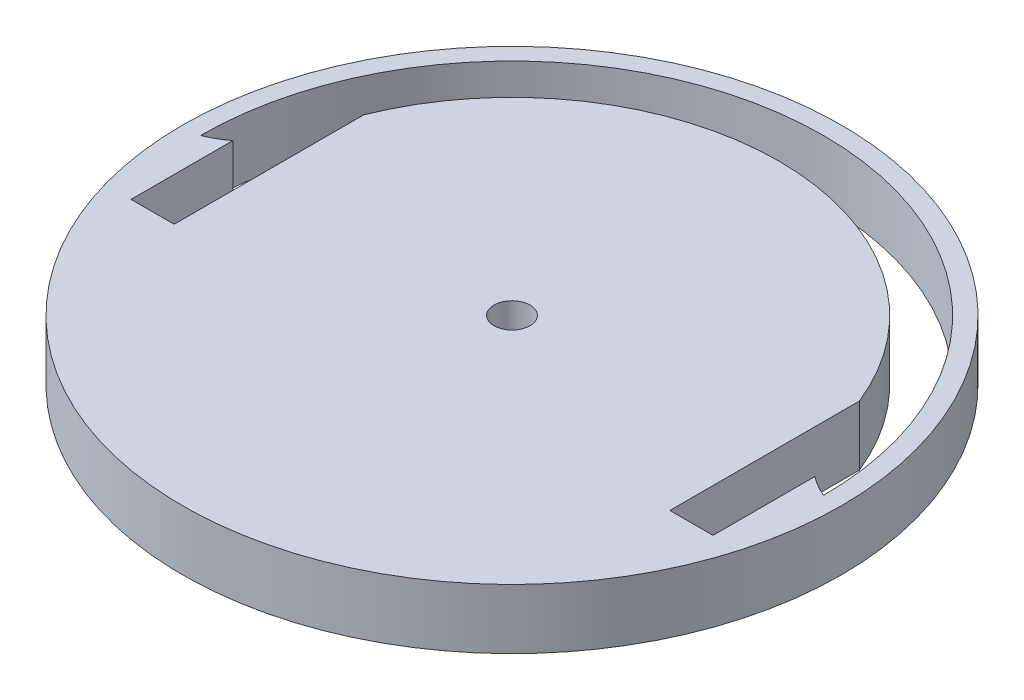
ISO-10303-21;
HEADER;
FILE_DESCRIPTION(('STEP AP214'),'2;1');
FILE_NAME('part.step','',(''),(''),'','','');
FILE_SCHEMA(('AUTOMOTIVE_DESIGN { 1 0 10303 214 1 1 1 1 }'));
ENDSEC;
DATA;
#1=APPLICATION_CONTEXT('core data for automotive mechanical design processes');
#2=APPLICATION_PROTOCOL_DEFINITION('international standard','automotive_design',2000,#1);
#3=PRODUCT_CONTEXT('',#1,'mechanical');
#4=PRODUCT('Part','Part','',(#3));
#5=PRODUCT_RELATED_PRODUCT_CATEGORY('part','',(#4));
#6=PRODUCT_DEFINITION_FORMATION('','',#4);
#7=PRODUCT_DEFINITION_CONTEXT('part definition',#1,'design');
#8=PRODUCT_DEFINITION('design','',#6,#7);
#9=PRODUCT_DEFINITION_SHAPE('','',#8);
#10=(LENGTH_UNIT() NAMED_UNIT(*) SI_UNIT(.MILLI.,.METRE.));
#11=(NAMED_UNIT(*) PLANE_ANGLE_UNIT() SI_UNIT($,.RADIAN.));
#12=(NAMED_UNIT(*) SI_UNIT($,.STERADIAN.) SOLID_ANGLE_UNIT());
#13=UNCERTAINTY_MEASURE_WITH_UNIT(LENGTH_MEASURE(1.E-05),#10,'distance_accuracy_value','');
#14=(GEOMETRIC_REPRESENTATION_CONTEXT(3) GLOBAL_UNCERTAINTY_ASSIGNED_CONTEXT((#13)) GLOBAL_UNIT_ASSIGNED_CONTEXT((#10,
#11,#12)) REPRESENTATION_CONTEXT('',''));
#15=CARTESIAN_POINT('',(0.,0.,0.));
#16=DIRECTION('',(0.,0.,1.));
#17=DIRECTION('',(1.,0.,0.));
#18=AXIS2_PLACEMENT_3D('',#15,#16,#17);
#19=CARTESIAN_POINT('',(0.971653231536432,244.999999767169,4.52790405895889));
#20=DIRECTION('',(0.,-1.,0.));
#21=DIRECTION('',(1.,0.,0.));
#22=AXIS2_PLACEMENT_3D('',#19,#20,#21);
#23=PLANE('',#22);
#24=CARTESIAN_POINT('',(-56.3130759447737,244.999999767169,-8.65909959387293));
#25=DIRECTION('',(0.,-1.,0.));
#26=DIRECTION('',(1.,0.,0.));
#27=AXIS2_PLACEMENT_3D('',#24,#25,#26);
#28=CIRCLE('',#27,14.2065276477661);
#29=CARTESIAN_POINT('',(-47.5902969769283,244.999999767169,2.55422082805641));
#30=VERTEX_POINT('',#29);
#31=CARTESIAN_POINT('',(-51.0283467684636,244.999999767169,4.5279040589589));
#32=VERTEX_POINT('',#31);
#33=EDGE_CURVE('E31',#30,#32,#28,.T.);
#34=ORIENTED_EDGE('',*,*,#33,.F.);
#35=DIRECTION('',(0.,0.,-1.));
#36=VECTOR('',#35,1.);
#37=CARTESIAN_POINT('',(-47.5902969769283,244.999999767169,19.5474157856382));
#38=LINE('',#37,#36);
#39=CARTESIAN_POINT('',(-47.5902969769283,244.999999767169,19.5474157856382));
#40=VERTEX_POINT('',#39);
#41=EDGE_CURVE('E112',#40,#30,#38,.T.);
#42=ORIENTED_EDGE('',*,*,#41,.F.);
#43=DIRECTION('',(-1.,0.,0.));
#44=VECTOR('',#43,1.);
#45=CARTESIAN_POINT('',(-47.5902969769283,244.999999767169,19.5474157856382));
#46=LINE('',#45,#44);
#47=CARTESIAN_POINT('',(-40.3902969769283,244.999999767169,19.5474157856382));
#48=VERTEX_POINT('',#47);
#49=EDGE_CURVE('E115',#48,#40,#46,.T.);
#50=ORIENTED_EDGE('',*,*,#49,.F.);
#51=DIRECTION('',(0.,0.,1.));
#52=VECTOR('',#51,1.);
#53=CARTESIAN_POINT('',(-40.3902969769283,244.999999767169,19.5474157856382));
#54=LINE('',#53,#52);
#55=CARTESIAN_POINT('',(-40.3902969769283,244.999999767169,-12.092807728759));
#56=VERTEX_POINT('',#55);
#57=EDGE_CURVE('E155',#56,#48,#54,.T.);
#58=ORIENTED_EDGE('',*,*,#57,.F.);
#59=CARTESIAN_POINT('',(0.971653231536432,244.999999767169,4.52790405895889));
#60=DIRECTION('',(0.,1.,0.));
#61=DIRECTION('',(1.,0.,0.));
#62=AXIS2_PLACEMENT_3D('',#59,#60,#61);
#63=CIRCLE('',#62,44.5764398015129);
#64=CARTESIAN_POINT('',(42.3336034400012,244.999999767169,-12.092807728759));
#65=VERTEX_POINT('',#64);
#66=EDGE_CURVE('E152',#65,#56,#63,.T.);
#67=ORIENTED_EDGE('',*,*,#66,.F.);
#68=DIRECTION('',(0.,0.,-1.));
#69=VECTOR('',#68,1.);
#70=CARTESIAN_POINT('',(42.3336034400012,244.999999767169,19.5474157856382));
#71=LINE('',#70,#69);
#72=CARTESIAN_POINT('',(42.3336034400012,244.999999767169,19.5474157856382));
#73=VERTEX_POINT('',#72);
#74=EDGE_CURVE('E149',#73,#65,#71,.T.);
#75=ORIENTED_EDGE('',*,*,#74,.F.);
#76=DIRECTION('',(-1.,0.,0.));
#77=VECTOR('',#76,1.);
#78=CARTESIAN_POINT('',(49.5336034400012,244.999999767169,19.5474157856382));
#79=LINE('',#78,#77);
#80=CARTESIAN_POINT('',(49.5336034400012,244.999999767169,19.5474157856382));
#81=VERTEX_POINT('',#80);
#82=EDGE_CURVE('E146',#81,#73,#79,.T.);
#83=ORIENTED_EDGE('',*,*,#82,.F.);
#84=DIRECTION('',(0.,0.,1.));
#85=VECTOR('',#84,1.);
#86=CARTESIAN_POINT('',(49.5336034400012,244.999999767169,19.5474157856382));
#87=LINE('',#86,#85);
#88=CARTESIAN_POINT('',(49.5336034400012,244.999999767169,2.55422082805641));
#89=VERTEX_POINT('',#88);
#90=EDGE_CURVE('E143',#89,#81,#87,.T.);
#91=ORIENTED_EDGE('',*,*,#90,.F.);
#92=CARTESIAN_POINT('',(58.2563824078465,244.999999767169,-8.65909959387293));
#93=DIRECTION('',(0.,-1.,0.));
#94=DIRECTION('',(-1.,0.,0.));
#95=AXIS2_PLACEMENT_3D('',#92,#93,#94);
#96=CIRCLE('',#95,14.2065276477661);
#97=CARTESIAN_POINT('',(52.9716532315364,244.999999767169,4.52790405895889));
#98=VERTEX_POINT('',#97);
#99=EDGE_CURVE('E140',#98,#89,#96,.T.);
#100=ORIENTED_EDGE('',*,*,#99,.F.);
#101=CARTESIAN_POINT('',(0.971653231536432,244.999999767169,4.52790405895889));
#102=DIRECTION('',(0.,-1.,0.));
#103=DIRECTION('',(1.,0.,0.));
#104=AXIS2_PLACEMENT_3D('',#101,#102,#103);
#105=CIRCLE('',#104,52.);
#106=EDGE_CURVE('E138',#32,#98,#105,.T.);
#107=ORIENTED_EDGE('',*,*,#106,.F.);
#108=EDGE_LOOP('',(#34,#42,#50,#58,#67,#75,#83,#91,#100,#107));
#109=FACE_BOUND('',#108,.T.);
#110=CARTESIAN_POINT('',(0.971653231536432,244.999999767169,4.52790405895889));
#111=DIRECTION('',(0.,-1.,0.));
#112=DIRECTION('',(1.,0.,0.));
#113=AXIS2_PLACEMENT_3D('',#110,#111,#112);
#114=CIRCLE('',#113,55.);
#115=CARTESIAN_POINT('',(55.9716532315364,244.999999767169,4.52790405895889));
#116=VERTEX_POINT('',#115);
#117=EDGE_CURVE('E10',#116,#116,#114,.T.);
#118=ORIENTED_EDGE('',*,*,#117,.T.);
#119=EDGE_LOOP('',(#118));
#120=FACE_BOUND('',#119,.T.);
#121=CARTESIAN_POINT('',(0.971653231536432,244.999999767169,4.52790405895889));
#122=DIRECTION('',(0.,-1.,0.));
#123=DIRECTION('',(1.,0.,0.));
#124=AXIS2_PLACEMENT_3D('',#121,#122,#123);
#125=CIRCLE('',#124,3.);
#126=CARTESIAN_POINT('',(3.97165323153643,244.999999767169,4.52790405895889));
#127=VERTEX_POINT('',#126);
#128=EDGE_CURVE('E178',#127,#127,#125,.T.);
#129=ORIENTED_EDGE('',*,*,#128,.F.);
#130=EDGE_LOOP('',(#129));
#131=FACE_BOUND('',#130,.T.);
#132=ADVANCED_FACE('F16',(#109,#120,#131),#23,.T.);
#133=CARTESIAN_POINT('',(0.971653231536432,254.999999767169,4.52790405895893));
#134=DIRECTION('',(0.,-1.,0.));
#135=DIRECTION('',(1.,0.,0.));
#136=AXIS2_PLACEMENT_3D('',#133,#134,#135);
#137=PLANE('',#136);
#138=DIRECTION('',(0.,0.,-1.));
#139=VECTOR('',#138,1.);
#140=CARTESIAN_POINT('',(-47.5902969769283,254.999999767169,19.5474157856383));
#141=LINE('',#140,#139);
#142=CARTESIAN_POINT('',(-47.5902969769283,254.999999767169,19.5474157856383));
#143=VERTEX_POINT('',#142);
#144=CARTESIAN_POINT('',(-47.5902969769283,254.999999767169,2.55422082805645));
#145=VERTEX_POINT('',#144);
#146=EDGE_CURVE('E101',#143,#145,#141,.T.);
#147=ORIENTED_EDGE('',*,*,#146,.T.);
#148=CARTESIAN_POINT('',(-56.3130759447737,254.999999767169,-8.65909959387289));
#149=DIRECTION('',(0.,-1.,0.));
#150=DIRECTION('',(1.,0.,0.));
#151=AXIS2_PLACEMENT_3D('',#148,#149,#150);
#152=CIRCLE('',#151,14.2065276477661);
#153=CARTESIAN_POINT('',(-51.0283467684636,254.999999767169,4.52790405895893));
#154=VERTEX_POINT('',#153);
#155=EDGE_CURVE('E95',#145,#154,#152,.T.);
#156=ORIENTED_EDGE('',*,*,#155,.T.);
#157=CARTESIAN_POINT('',(0.971653231536432,254.999999767169,4.52790405895893));
#158=DIRECTION('',(0.,-1.,0.));
#159=DIRECTION('',(1.,0.,0.));
#160=AXIS2_PLACEMENT_3D('',#157,#158,#159);
#161=CIRCLE('',#160,52.);
#162=CARTESIAN_POINT('',(52.9716532315364,254.999999767169,4.52790405895893));
#163=VERTEX_POINT('',#162);
#164=EDGE_CURVE('E104',#154,#163,#161,.T.);
#165=ORIENTED_EDGE('',*,*,#164,.T.);
#166=CARTESIAN_POINT('',(58.2563824078465,254.999999767169,-8.65909959387289));
#167=DIRECTION('',(0.,-1.,0.));
#168=DIRECTION('',(-1.,0.,0.));
#169=AXIS2_PLACEMENT_3D('',#166,#167,#168);
#170=CIRCLE('',#169,14.2065276477661);
#171=CARTESIAN_POINT('',(49.5336034400012,254.999999767169,2.55422082805645));
#172=VERTEX_POINT('',#171);
#173=EDGE_CURVE('E39',#163,#172,#170,.T.);
#174=ORIENTED_EDGE('',*,*,#173,.T.);
#175=DIRECTION('',(0.,0.,1.));
#176=VECTOR('',#175,1.);
#177=CARTESIAN_POINT('',(49.5336034400012,254.999999767169,19.5474157856383));
#178=LINE('',#177,#176);
#179=CARTESIAN_POINT('',(49.5336034400012,254.999999767169,19.5474157856383));
#180=VERTEX_POINT('',#179);
#181=EDGE_CURVE('E119',#172,#180,#178,.T.);
#182=ORIENTED_EDGE('',*,*,#181,.T.);
#183=DIRECTION('',(-1.,0.,0.));
#184=VECTOR('',#183,1.);
#185=CARTESIAN_POINT('',(49.5336034400012,254.999999767169,19.5474157856383));
#186=LINE('',#185,#184);
#187=CARTESIAN_POINT('',(42.3336034400012,254.999999767169,19.5474157856383));
#188=VERTEX_POINT('',#187);
#189=EDGE_CURVE('E122',#180,#188,#186,.T.);
#190=ORIENTED_EDGE('',*,*,#189,.T.);
#191=DIRECTION('',(0.,0.,-1.));
#192=VECTOR('',#191,1.);
#193=CARTESIAN_POINT('',(42.3336034400012,254.999999767169,19.5474157856383));
#194=LINE('',#193,#192);
#195=CARTESIAN_POINT('',(42.3336034400012,254.999999767169,-12.092807728759));
#196=VERTEX_POINT('',#195);
#197=EDGE_CURVE('E125',#188,#196,#194,.T.);
#198=ORIENTED_EDGE('',*,*,#197,.T.);
#199=CARTESIAN_POINT('',(0.971653231536432,254.999999767169,4.52790405895893));
#200=DIRECTION('',(0.,1.,0.));
#201=DIRECTION('',(1.,0.,0.));
#202=AXIS2_PLACEMENT_3D('',#199,#200,#201);
#203=CIRCLE('',#202,44.5764398015129);
#204=CARTESIAN_POINT('',(-40.3902969769283,254.999999767169,-12.092807728759));
#205=VERTEX_POINT('',#204);
#206=EDGE_CURVE('E128',#196,#205,#203,.T.);
#207=ORIENTED_EDGE('',*,*,#206,.T.);
#208=DIRECTION('',(0.,0.,1.));
#209=VECTOR('',#208,1.);
#210=CARTESIAN_POINT('',(-40.3902969769283,254.999999767169,19.5474157856383));
#211=LINE('',#210,#209);
#212=CARTESIAN_POINT('',(-40.3902969769283,254.999999767169,19.5474157856383));
#213=VERTEX_POINT('',#212);
#214=EDGE_CURVE('E131',#205,#213,#211,.T.);
#215=ORIENTED_EDGE('',*,*,#214,.T.);
#216=DIRECTION('',(-1.,0.,0.));
#217=VECTOR('',#216,1.);
#218=CARTESIAN_POINT('',(-47.5902969769283,254.999999767169,19.5474157856383));
#219=LINE('',#218,#217);
#220=EDGE_CURVE('E134',#213,#143,#219,.T.);
#221=ORIENTED_EDGE('',*,*,#220,.T.);
#222=EDGE_LOOP('',(#147,#156,#165,#174,#182,#190,#198,#207,#215,#221));
#223=FACE_BOUND('',#222,.T.);
#224=CARTESIAN_POINT('',(0.971653231536432,254.999999767169,4.52790405895893));
#225=DIRECTION('',(0.,-1.,0.));
#226=DIRECTION('',(1.,0.,0.));
#227=AXIS2_PLACEMENT_3D('',#224,#225,#226);
#228=CIRCLE('',#227,55.);
#229=CARTESIAN_POINT('',(55.9716532315364,254.999999767169,4.52790405895893));
#230=VERTEX_POINT('',#229);
#231=EDGE_CURVE('E20',#230,#230,#228,.T.);
#232=ORIENTED_EDGE('',*,*,#231,.F.);
#233=EDGE_LOOP('',(#232));
#234=FACE_BOUND('',#233,.T.);
#235=CARTESIAN_POINT('',(0.971653231536432,254.999999767169,4.52790405895893));
#236=DIRECTION('',(0.,-1.,0.));
#237=DIRECTION('',(1.,0.,0.));
#238=AXIS2_PLACEMENT_3D('',#235,#236,#237);
#239=CIRCLE('',#238,3.);
#240=CARTESIAN_POINT('',(3.97165323153643,254.999999767169,4.52790405895893));
#241=VERTEX_POINT('',#240);
#242=EDGE_CURVE('E162',#241,#241,#239,.T.);
#243=ORIENTED_EDGE('',*,*,#242,.T.);
#244=EDGE_LOOP('',(#243));
#245=FACE_BOUND('',#244,.T.);
#246=ADVANCED_FACE('F108',(#223,#234,#245),#137,.F.);
#247=CARTESIAN_POINT('',(0.971653231536432,244.999999767169,4.52790405895889));
#248=DIRECTION('',(0.,1.,0.));
#249=DIRECTION('',(-1.,0.,0.));
#250=AXIS2_PLACEMENT_3D('',#247,#248,#249);
#251=CYLINDRICAL_SURFACE('',#250,55.);
#252=ORIENTED_EDGE('',*,*,#117,.F.);
#253=EDGE_LOOP('',(#252));
#254=FACE_BOUND('',#253,.T.);
#255=ORIENTED_EDGE('',*,*,#231,.T.);
#256=EDGE_LOOP('',(#255));
#257=FACE_BOUND('',#256,.T.);
#258=ADVANCED_FACE('F18',(#254,#257),#251,.T.);
#259=CARTESIAN_POINT('',(0.971653231536432,244.999999767169,4.52790405895889));
#260=DIRECTION('',(0.,1.,0.));
#261=DIRECTION('',(-1.,0.,0.));
#262=AXIS2_PLACEMENT_3D('',#259,#260,#261);
#263=CYLINDRICAL_SURFACE('',#262,3.);
#264=ORIENTED_EDGE('',*,*,#128,.T.);
#265=EDGE_LOOP('',(#264));
#266=FACE_BOUND('',#265,.T.);
#267=ORIENTED_EDGE('',*,*,#242,.F.);
#268=EDGE_LOOP('',(#267));
#269=FACE_BOUND('',#268,.T.);
#270=ADVANCED_FACE('F185',(#266,#269),#263,.F.);
#271=CARTESIAN_POINT('',(-56.3130759447737,254.999999767169,-8.65909959387289));
#272=DIRECTION('',(0.,-1.,0.));
#273=DIRECTION('',(1.,0.,0.));
#274=AXIS2_PLACEMENT_3D('',#271,#272,#273);
#275=CYLINDRICAL_SURFACE('',#274,14.2065276477661);
#276=ORIENTED_EDGE('',*,*,#33,.T.);
#277=DIRECTION('',(0.,-1.,0.));
#278=VECTOR('',#277,1.);
#279=CARTESIAN_POINT('',(-51.0283467684636,254.999999767169,4.52790405895893));
#280=LINE('',#279,#278);
#281=EDGE_CURVE('E91',#154,#32,#280,.T.);
#282=ORIENTED_EDGE('',*,*,#281,.F.);
#283=ORIENTED_EDGE('',*,*,#155,.F.);
#284=DIRECTION('',(0.,-1.,0.));
#285=VECTOR('',#284,1.);
#286=CARTESIAN_POINT('',(-47.5902969769283,254.999999767169,2.55422082805645));
#287=LINE('',#286,#285);
#288=EDGE_CURVE('E160',#145,#30,#287,.T.);
#289=ORIENTED_EDGE('',*,*,#288,.T.);
#290=EDGE_LOOP('',(#276,#282,#283,#289));
#291=FACE_BOUND('',#290,.T.);
#292=ADVANCED_FACE('F93',(#291),#275,.F.);
#293=CARTESIAN_POINT('',(-47.5902969769283,254.999999767169,19.5474157856383));
#294=DIRECTION('',(-1.,0.,0.));
#295=DIRECTION('',(0.,-1.,0.));
#296=AXIS2_PLACEMENT_3D('',#293,#294,#295);
#297=PLANE('',#296);
#298=ORIENTED_EDGE('',*,*,#41,.T.);
#299=ORIENTED_EDGE('',*,*,#288,.F.);
#300=ORIENTED_EDGE('',*,*,#146,.F.);
#301=DIRECTION('',(0.,-1.,0.));
#302=VECTOR('',#301,1.);
#303=CARTESIAN_POINT('',(-47.5902969769283,254.999999767169,19.5474157856383));
#304=LINE('',#303,#302);
#305=EDGE_CURVE('E163',#143,#40,#304,.T.);
#306=ORIENTED_EDGE('',*,*,#305,.T.);
#307=EDGE_LOOP('',(#298,#299,#300,#306));
#308=FACE_BOUND('',#307,.T.);
#309=ADVANCED_FACE('F194',(#308),#297,.F.);
#310=CARTESIAN_POINT('',(-47.5902969769283,254.999999767169,19.5474157856383));
#311=DIRECTION('',(0.,0.,1.));
#312=DIRECTION('',(0.,-1.,0.));
#313=AXIS2_PLACEMENT_3D('',#310,#311,#312);
#314=PLANE('',#313);
#315=ORIENTED_EDGE('',*,*,#49,.T.);
#316=ORIENTED_EDGE('',*,*,#305,.F.);
#317=ORIENTED_EDGE('',*,*,#220,.F.);
#318=DIRECTION('',(0.,-1.,0.));
#319=VECTOR('',#318,1.);
#320=CARTESIAN_POINT('',(-40.3902969769283,254.999999767169,19.5474157856383));
#321=LINE('',#320,#319);
#322=EDGE_CURVE('E165',#213,#48,#321,.T.);
#323=ORIENTED_EDGE('',*,*,#322,.T.);
#324=EDGE_LOOP('',(#315,#316,#317,#323));
#325=FACE_BOUND('',#324,.T.);
#326=ADVANCED_FACE('F236',(#325),#314,.F.);
#327=CARTESIAN_POINT('',(-40.3902969769283,254.999999767169,19.5474157856383));
#328=DIRECTION('',(1.,0.,0.));
#329=DIRECTION('',(0.,1.,0.));
#330=AXIS2_PLACEMENT_3D('',#327,#328,#329);
#331=PLANE('',#330);
#332=ORIENTED_EDGE('',*,*,#57,.T.);
#333=ORIENTED_EDGE('',*,*,#322,.F.);
#334=ORIENTED_EDGE('',*,*,#214,.F.);
#335=DIRECTION('',(0.,-1.,0.));
#336=VECTOR('',#335,1.);
#337=CARTESIAN_POINT('',(-40.3902969769283,254.999999767169,-12.092807728759));
#338=LINE('',#337,#336);
#339=EDGE_CURVE('E167',#205,#56,#338,.T.);
#340=ORIENTED_EDGE('',*,*,#339,.T.);
#341=EDGE_LOOP('',(#332,#333,#334,#340));
#342=FACE_BOUND('',#341,.T.);
#343=ADVANCED_FACE('F233',(#342),#331,.F.);
#344=CARTESIAN_POINT('',(0.971653231536432,254.999999767169,4.52790405895893));
#345=DIRECTION('',(0.,-1.,0.));
#346=DIRECTION('',(1.,0.,0.));
#347=AXIS2_PLACEMENT_3D('',#344,#345,#346);
#348=CYLINDRICAL_SURFACE('',#347,44.5764398015129);
#349=ORIENTED_EDGE('',*,*,#66,.T.);
#350=ORIENTED_EDGE('',*,*,#339,.F.);
#351=ORIENTED_EDGE('',*,*,#206,.F.);
#352=DIRECTION('',(0.,-1.,0.));
#353=VECTOR('',#352,1.);
#354=CARTESIAN_POINT('',(42.3336034400012,254.999999767169,-12.092807728759));
#355=LINE('',#354,#353);
#356=EDGE_CURVE('E169',#196,#65,#355,.T.);
#357=ORIENTED_EDGE('',*,*,#356,.T.);
#358=EDGE_LOOP('',(#349,#350,#351,#357));
#359=FACE_BOUND('',#358,.T.);
#360=ADVANCED_FACE('F229',(#359),#348,.T.);
#361=CARTESIAN_POINT('',(42.3336034400012,254.999999767169,19.5474157856383));
#362=DIRECTION('',(-1.,0.,0.));
#363=DIRECTION('',(0.,-1.,0.));
#364=AXIS2_PLACEMENT_3D('',#361,#362,#363);
#365=PLANE('',#364);
#366=ORIENTED_EDGE('',*,*,#74,.T.);
#367=ORIENTED_EDGE('',*,*,#356,.F.);
#368=ORIENTED_EDGE('',*,*,#197,.F.);
#369=DIRECTION('',(0.,-1.,0.));
#370=VECTOR('',#369,1.);
#371=CARTESIAN_POINT('',(42.3336034400012,254.999999767169,19.5474157856383));
#372=LINE('',#371,#370);
#373=EDGE_CURVE('E171',#188,#73,#372,.T.);
#374=ORIENTED_EDGE('',*,*,#373,.T.);
#375=EDGE_LOOP('',(#366,#367,#368,#374));
#376=FACE_BOUND('',#375,.T.);
#377=ADVANCED_FACE('F225',(#376),#365,.F.);
#378=CARTESIAN_POINT('',(49.5336034400012,254.999999767169,19.5474157856383));
#379=DIRECTION('',(0.,0.,1.));
#380=DIRECTION('',(0.,-1.,0.));
#381=AXIS2_PLACEMENT_3D('',#378,#379,#380);
#382=PLANE('',#381);
#383=ORIENTED_EDGE('',*,*,#82,.T.);
#384=ORIENTED_EDGE('',*,*,#373,.F.);
#385=ORIENTED_EDGE('',*,*,#189,.F.);
#386=DIRECTION('',(0.,-1.,0.));
#387=VECTOR('',#386,1.);
#388=CARTESIAN_POINT('',(49.5336034400012,254.999999767169,19.5474157856383));
#389=LINE('',#388,#387);
#390=EDGE_CURVE('E173',#180,#81,#389,.T.);
#391=ORIENTED_EDGE('',*,*,#390,.T.);
#392=EDGE_LOOP('',(#383,#384,#385,#391));
#393=FACE_BOUND('',#392,.T.);
#394=ADVANCED_FACE('F222',(#393),#382,.F.);
#395=CARTESIAN_POINT('',(49.5336034400012,254.999999767169,19.5474157856383));
#396=DIRECTION('',(1.,0.,0.));
#397=DIRECTION('',(0.,1.,0.));
#398=AXIS2_PLACEMENT_3D('',#395,#396,#397);
#399=PLANE('',#398);
#400=ORIENTED_EDGE('',*,*,#90,.T.);
#401=ORIENTED_EDGE('',*,*,#390,.F.);
#402=ORIENTED_EDGE('',*,*,#181,.F.);
#403=DIRECTION('',(0.,-1.,0.));
#404=VECTOR('',#403,1.);
#405=CARTESIAN_POINT('',(49.5336034400012,254.999999767169,2.55422082805645));
#406=LINE('',#405,#404);
#407=EDGE_CURVE('E175',#172,#89,#406,.T.);
#408=ORIENTED_EDGE('',*,*,#407,.T.);
#409=EDGE_LOOP('',(#400,#401,#402,#408));
#410=FACE_BOUND('',#409,.T.);
#411=ADVANCED_FACE('F218',(#410),#399,.F.);
#412=CARTESIAN_POINT('',(58.2563824078465,254.999999767169,-8.65909959387289));
#413=DIRECTION('',(0.,-1.,0.));
#414=DIRECTION('',(1.,0.,0.));
#415=AXIS2_PLACEMENT_3D('',#412,#413,#414);
#416=CYLINDRICAL_SURFACE('',#415,14.2065276477661);
#417=ORIENTED_EDGE('',*,*,#99,.T.);
#418=ORIENTED_EDGE('',*,*,#407,.F.);
#419=ORIENTED_EDGE('',*,*,#173,.F.);
#420=DIRECTION('',(0.,-1.,0.));
#421=VECTOR('',#420,1.);
#422=CARTESIAN_POINT('',(52.9716532315364,254.999999767169,4.52790405895893));
#423=LINE('',#422,#421);
#424=EDGE_CURVE('E100',#163,#98,#423,.T.);
#425=ORIENTED_EDGE('',*,*,#424,.T.);
#426=EDGE_LOOP('',(#417,#418,#419,#425));
#427=FACE_BOUND('',#426,.T.);
#428=ADVANCED_FACE('F215',(#427),#416,.F.);
#429=CARTESIAN_POINT('',(0.971653231536432,254.999999767169,4.52790405895893));
#430=DIRECTION('',(0.,-1.,0.));
#431=DIRECTION('',(1.,0.,0.));
#432=AXIS2_PLACEMENT_3D('',#429,#430,#431);
#433=CYLINDRICAL_SURFACE('',#432,52.);
#434=ORIENTED_EDGE('',*,*,#106,.T.);
#435=ORIENTED_EDGE('',*,*,#424,.F.);
#436=ORIENTED_EDGE('',*,*,#164,.F.);
#437=ORIENTED_EDGE('',*,*,#281,.T.);
#438=EDGE_LOOP('',(#434,#435,#436,#437));
#439=FACE_BOUND('',#438,.T.);
#440=ADVANCED_FACE('F105',(#439),#433,.F.);
#441=CLOSED_SHELL('',(#132,#246,#258,#270,#292,#309,#326,#343,#360,#377,#394,#411,#428,#440));
#442=MANIFOLD_SOLID_BREP('B1',#441);
#443=ADVANCED_BREP_SHAPE_REPRESENTATION('',(#18,#442),#14);
#444=SHAPE_DEFINITION_REPRESENTATION(#9,#443);
ENDSEC;
END-ISO-10303-21;
